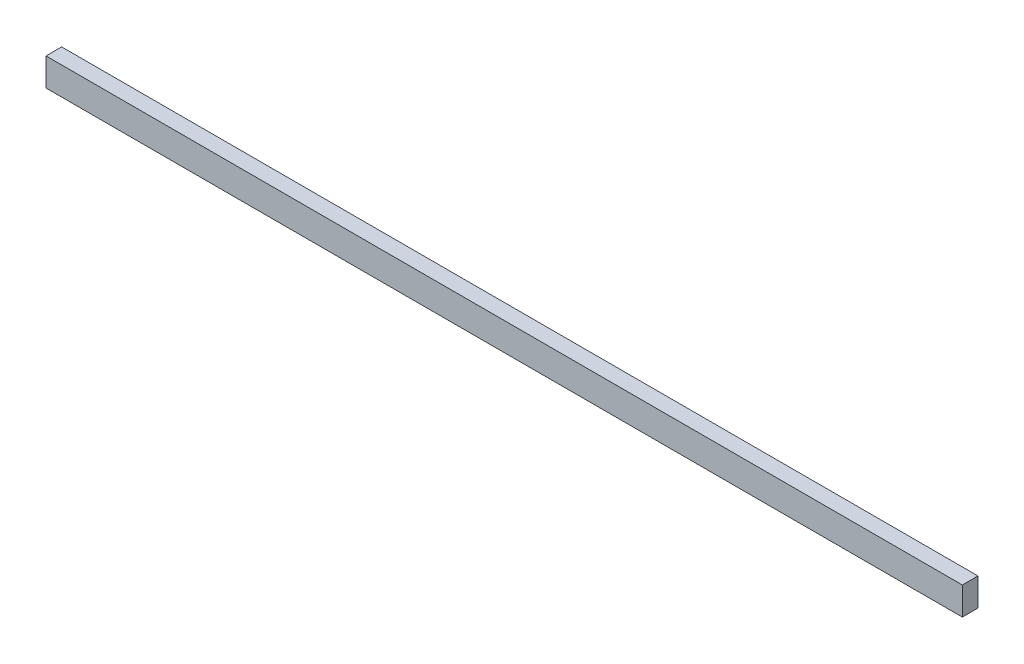
ISO-10303-21;
HEADER;
FILE_DESCRIPTION(('STEP AP214'),'2;1');
FILE_NAME('part.step','',(''),(''),'','','');
FILE_SCHEMA(('AUTOMOTIVE_DESIGN { 1 0 10303 214 1 1 1 1 }'));
ENDSEC;
DATA;
#1=APPLICATION_CONTEXT('core data for automotive mechanical design processes');
#2=APPLICATION_PROTOCOL_DEFINITION('international standard','automotive_design',2000,#1);
#3=PRODUCT_CONTEXT('',#1,'mechanical');
#4=PRODUCT('Part','Part','',(#3));
#5=PRODUCT_RELATED_PRODUCT_CATEGORY('part','',(#4));
#6=PRODUCT_DEFINITION_FORMATION('','',#4);
#7=PRODUCT_DEFINITION_CONTEXT('part definition',#1,'design');
#8=PRODUCT_DEFINITION('design','',#6,#7);
#9=PRODUCT_DEFINITION_SHAPE('','',#8);
#10=(LENGTH_UNIT() NAMED_UNIT(*) SI_UNIT(.MILLI.,.METRE.));
#11=(NAMED_UNIT(*) PLANE_ANGLE_UNIT() SI_UNIT($,.RADIAN.));
#12=(NAMED_UNIT(*) SI_UNIT($,.STERADIAN.) SOLID_ANGLE_UNIT());
#13=UNCERTAINTY_MEASURE_WITH_UNIT(LENGTH_MEASURE(1.E-05),#10,'distance_accuracy_value','');
#14=(GEOMETRIC_REPRESENTATION_CONTEXT(3) GLOBAL_UNCERTAINTY_ASSIGNED_CONTEXT((#13)) GLOBAL_UNIT_ASSIGNED_CONTEXT((#10,
#11,#12)) REPRESENTATION_CONTEXT('',''));
#15=CARTESIAN_POINT('',(0.,0.,0.));
#16=DIRECTION('',(0.,0.,1.));
#17=DIRECTION('',(1.,0.,0.));
#18=AXIS2_PLACEMENT_3D('',#15,#16,#17);
#19=CARTESIAN_POINT('',(527.,0.,0.));
#20=DIRECTION('',(0.,0.,-1.));
#21=DIRECTION('',(-1.,0.,0.));
#22=AXIS2_PLACEMENT_3D('',#19,#20,#21);
#23=PLANE('',#22);
#24=DIRECTION('',(0.,-1.,0.));
#25=VECTOR('',#24,1.);
#26=CARTESIAN_POINT('',(0.,0.,0.));
#27=LINE('',#26,#25);
#28=CARTESIAN_POINT('',(0.,16.,0.));
#29=VERTEX_POINT('',#28);
#30=CARTESIAN_POINT('',(0.,0.,0.));
#31=VERTEX_POINT('',#30);
#32=EDGE_CURVE('E95',#29,#31,#27,.T.);
#33=ORIENTED_EDGE('',*,*,#32,.T.);
#34=DIRECTION('',(-1.,0.,0.));
#35=VECTOR('',#34,1.);
#36=CARTESIAN_POINT('',(527.,0.,0.));
#37=LINE('',#36,#35);
#38=CARTESIAN_POINT('',(527.,0.,0.));
#39=VERTEX_POINT('',#38);
#40=EDGE_CURVE('E11',#39,#31,#37,.T.);
#41=ORIENTED_EDGE('',*,*,#40,.F.);
#42=DIRECTION('',(0.,-1.,0.));
#43=VECTOR('',#42,1.);
#44=CARTESIAN_POINT('',(527.,0.,0.));
#45=LINE('',#44,#43);
#46=CARTESIAN_POINT('',(527.,16.,0.));
#47=VERTEX_POINT('',#46);
#48=EDGE_CURVE('E83',#47,#39,#45,.T.);
#49=ORIENTED_EDGE('',*,*,#48,.F.);
#50=DIRECTION('',(-1.,0.,0.));
#51=VECTOR('',#50,1.);
#52=CARTESIAN_POINT('',(527.,16.,0.));
#53=LINE('',#52,#51);
#54=EDGE_CURVE('E91',#47,#29,#53,.T.);
#55=ORIENTED_EDGE('',*,*,#54,.T.);
#56=EDGE_LOOP('',(#33,#41,#49,#55));
#57=FACE_BOUND('',#56,.T.);
#58=ADVANCED_FACE('F32',(#57),#23,.F.);
#59=CARTESIAN_POINT('',(527.,0.,0.));
#60=DIRECTION('',(0.,1.,0.));
#61=DIRECTION('',(0.,0.,1.));
#62=AXIS2_PLACEMENT_3D('',#59,#60,#61);
#63=PLANE('',#62);
#64=DIRECTION('',(0.,0.,-1.));
#65=VECTOR('',#64,1.);
#66=CARTESIAN_POINT('',(0.,0.,0.));
#67=LINE('',#66,#65);
#68=CARTESIAN_POINT('',(0.,0.,-9.));
#69=VERTEX_POINT('',#68);
#70=EDGE_CURVE('E87',#31,#69,#67,.T.);
#71=ORIENTED_EDGE('',*,*,#70,.T.);
#72=DIRECTION('',(-1.,0.,0.));
#73=VECTOR('',#72,1.);
#74=CARTESIAN_POINT('',(527.,0.,-9.));
#75=LINE('',#74,#73);
#76=CARTESIAN_POINT('',(527.,0.,-9.));
#77=VERTEX_POINT('',#76);
#78=EDGE_CURVE('E40',#77,#69,#75,.T.);
#79=ORIENTED_EDGE('',*,*,#78,.F.);
#80=DIRECTION('',(0.,0.,-1.));
#81=VECTOR('',#80,1.);
#82=CARTESIAN_POINT('',(527.,0.,0.));
#83=LINE('',#82,#81);
#84=EDGE_CURVE('E78',#39,#77,#83,.T.);
#85=ORIENTED_EDGE('',*,*,#84,.F.);
#86=ORIENTED_EDGE('',*,*,#40,.T.);
#87=EDGE_LOOP('',(#71,#79,#85,#86));
#88=FACE_BOUND('',#87,.T.);
#89=ADVANCED_FACE('F86',(#88),#63,.F.);
#90=CARTESIAN_POINT('',(527.,0.,-9.));
#91=DIRECTION('',(0.,0.,1.));
#92=DIRECTION('',(1.,0.,0.));
#93=AXIS2_PLACEMENT_3D('',#90,#91,#92);
#94=PLANE('',#93);
#95=DIRECTION('',(0.,1.,0.));
#96=VECTOR('',#95,1.);
#97=CARTESIAN_POINT('',(0.,0.,-9.));
#98=LINE('',#97,#96);
#99=CARTESIAN_POINT('',(0.,16.,-9.));
#100=VERTEX_POINT('',#99);
#101=EDGE_CURVE('E65',#69,#100,#98,.T.);
#102=ORIENTED_EDGE('',*,*,#101,.T.);
#103=DIRECTION('',(-1.,0.,0.));
#104=VECTOR('',#103,1.);
#105=CARTESIAN_POINT('',(527.,16.,-9.));
#106=LINE('',#105,#104);
#107=CARTESIAN_POINT('',(527.,16.,-9.));
#108=VERTEX_POINT('',#107);
#109=EDGE_CURVE('E88',#108,#100,#106,.T.);
#110=ORIENTED_EDGE('',*,*,#109,.F.);
#111=DIRECTION('',(0.,1.,0.));
#112=VECTOR('',#111,1.);
#113=CARTESIAN_POINT('',(527.,0.,-9.));
#114=LINE('',#113,#112);
#115=EDGE_CURVE('E81',#77,#108,#114,.T.);
#116=ORIENTED_EDGE('',*,*,#115,.F.);
#117=ORIENTED_EDGE('',*,*,#78,.T.);
#118=EDGE_LOOP('',(#102,#110,#116,#117));
#119=FACE_BOUND('',#118,.T.);
#120=ADVANCED_FACE('F89',(#119),#94,.F.);
#121=CARTESIAN_POINT('',(527.,16.,0.));
#122=DIRECTION('',(0.,-1.,0.));
#123=DIRECTION('',(0.,0.,-1.));
#124=AXIS2_PLACEMENT_3D('',#121,#122,#123);
#125=PLANE('',#124);
#126=DIRECTION('',(0.,0.,1.));
#127=VECTOR('',#126,1.);
#128=CARTESIAN_POINT('',(0.,16.,0.));
#129=LINE('',#128,#127);
#130=EDGE_CURVE('E71',#100,#29,#129,.T.);
#131=ORIENTED_EDGE('',*,*,#130,.T.);
#132=ORIENTED_EDGE('',*,*,#54,.F.);
#133=DIRECTION('',(0.,0.,1.));
#134=VECTOR('',#133,1.);
#135=CARTESIAN_POINT('',(527.,16.,0.));
#136=LINE('',#135,#134);
#137=EDGE_CURVE('E48',#108,#47,#136,.T.);
#138=ORIENTED_EDGE('',*,*,#137,.F.);
#139=ORIENTED_EDGE('',*,*,#109,.T.);
#140=EDGE_LOOP('',(#131,#132,#138,#139));
#141=FACE_BOUND('',#140,.T.);
#142=ADVANCED_FACE('F102',(#141),#125,.F.);
#143=CARTESIAN_POINT('',(527.,0.,0.));
#144=DIRECTION('',(-1.,0.,0.));
#145=DIRECTION('',(0.,0.,1.));
#146=AXIS2_PLACEMENT_3D('',#143,#144,#145);
#147=PLANE('',#146);
#148=ORIENTED_EDGE('',*,*,#48,.T.);
#149=ORIENTED_EDGE('',*,*,#84,.T.);
#150=ORIENTED_EDGE('',*,*,#115,.T.);
#151=ORIENTED_EDGE('',*,*,#137,.T.);
#152=EDGE_LOOP('',(#148,#149,#150,#151));
#153=FACE_BOUND('',#152,.T.);
#154=ADVANCED_FACE('F79',(#153),#147,.F.);
#155=CARTESIAN_POINT('',(0.,0.,0.));
#156=DIRECTION('',(-1.,0.,0.));
#157=DIRECTION('',(0.,0.,1.));
#158=AXIS2_PLACEMENT_3D('',#155,#156,#157);
#159=PLANE('',#158);
#160=ORIENTED_EDGE('',*,*,#32,.F.);
#161=ORIENTED_EDGE('',*,*,#130,.F.);
#162=ORIENTED_EDGE('',*,*,#101,.F.);
#163=ORIENTED_EDGE('',*,*,#70,.F.);
#164=EDGE_LOOP('',(#160,#161,#162,#163));
#165=FACE_BOUND('',#164,.T.);
#166=ADVANCED_FACE('F105',(#165),#159,.T.);
#167=CLOSED_SHELL('',(#58,#89,#120,#142,#154,#166));
#168=MANIFOLD_SOLID_BREP('B2',#167);
#169=ADVANCED_BREP_SHAPE_REPRESENTATION('',(#18,#168),#14);
#170=SHAPE_DEFINITION_REPRESENTATION(#9,#169);
ENDSEC;
END-ISO-10303-21;
